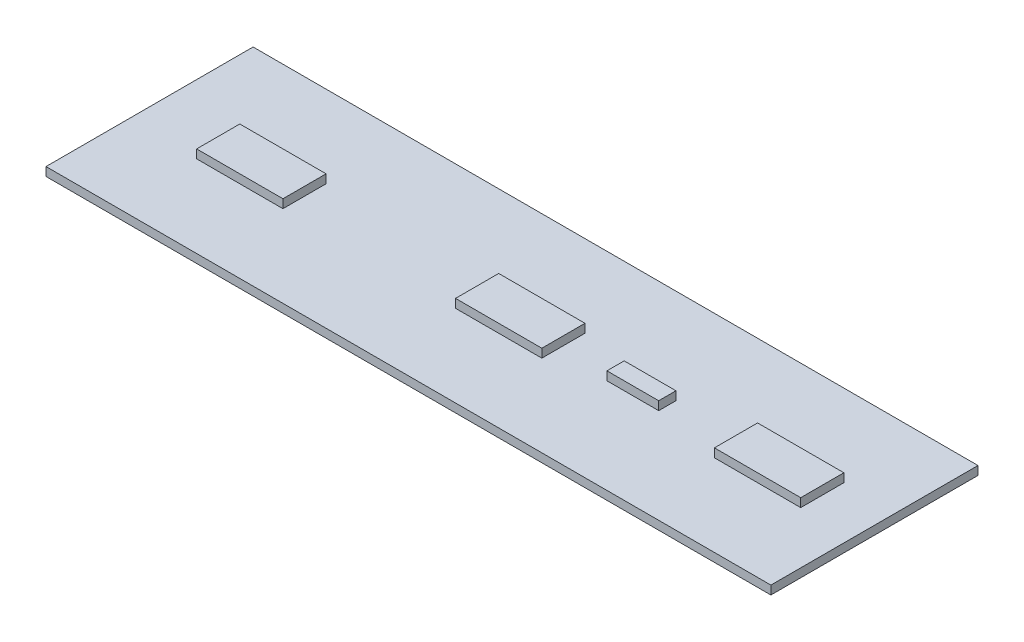
ISO-10303-21;
HEADER;
FILE_DESCRIPTION(('STEP AP214'),'2;1');
FILE_NAME('part.step','',(''),(''),'','','');
FILE_SCHEMA(('AUTOMOTIVE_DESIGN { 1 0 10303 214 1 1 1 1 }'));
ENDSEC;
DATA;
#1=APPLICATION_CONTEXT('core data for automotive mechanical design processes');
#2=APPLICATION_PROTOCOL_DEFINITION('international standard','automotive_design',2000,#1);
#3=PRODUCT_CONTEXT('',#1,'mechanical');
#4=PRODUCT('Part','Part','',(#3));
#5=PRODUCT_RELATED_PRODUCT_CATEGORY('part','',(#4));
#6=PRODUCT_DEFINITION_FORMATION('','',#4);
#7=PRODUCT_DEFINITION_CONTEXT('part definition',#1,'design');
#8=PRODUCT_DEFINITION('design','',#6,#7);
#9=PRODUCT_DEFINITION_SHAPE('','',#8);
#10=(LENGTH_UNIT() NAMED_UNIT(*) SI_UNIT(.MILLI.,.METRE.));
#11=(NAMED_UNIT(*) PLANE_ANGLE_UNIT() SI_UNIT($,.RADIAN.));
#12=(NAMED_UNIT(*) SI_UNIT($,.STERADIAN.) SOLID_ANGLE_UNIT());
#13=UNCERTAINTY_MEASURE_WITH_UNIT(LENGTH_MEASURE(1.E-05),#10,'distance_accuracy_value','');
#14=(GEOMETRIC_REPRESENTATION_CONTEXT(3) GLOBAL_UNCERTAINTY_ASSIGNED_CONTEXT((#13)) GLOBAL_UNIT_ASSIGNED_CONTEXT((#10,
#11,#12)) REPRESENTATION_CONTEXT('',''));
#15=CARTESIAN_POINT('',(0.,0.,0.));
#16=DIRECTION('',(0.,0.,1.));
#17=DIRECTION('',(1.,0.,0.));
#18=AXIS2_PLACEMENT_3D('',#15,#16,#17);
#19=CARTESIAN_POINT('',(0.,0.5,0.));
#20=DIRECTION('',(0.,1.,0.));
#21=DIRECTION('',(0.,0.,1.));
#22=AXIS2_PLACEMENT_3D('',#19,#20,#21);
#23=PLANE('',#22);
#24=DIRECTION('',(0.,0.,1.));
#25=VECTOR('',#24,1.);
#26=CARTESIAN_POINT('',(-24.7816091954023,0.5,-4.90804597701149));
#27=LINE('',#26,#25);
#28=CARTESIAN_POINT('',(-24.7816091954023,0.5,-4.90804597701149));
#29=VERTEX_POINT('',#28);
#30=CARTESIAN_POINT('',(-24.7816091954023,0.5,7.09195402298851));
#31=VERTEX_POINT('',#30);
#32=EDGE_CURVE('E288',#29,#31,#27,.T.);
#33=ORIENTED_EDGE('',*,*,#32,.T.);
#34=DIRECTION('',(1.,0.,0.));
#35=VECTOR('',#34,1.);
#36=CARTESIAN_POINT('',(-24.7816091954023,0.5,7.09195402298851));
#37=LINE('',#36,#35);
#38=CARTESIAN_POINT('',(17.2183908045977,0.5,7.09195402298851));
#39=VERTEX_POINT('',#38);
#40=EDGE_CURVE('E291',#31,#39,#37,.T.);
#41=ORIENTED_EDGE('',*,*,#40,.T.);
#42=DIRECTION('',(0.,0.,-1.));
#43=VECTOR('',#42,1.);
#44=CARTESIAN_POINT('',(17.2183908045977,0.5,-4.90804597701149));
#45=LINE('',#44,#43);
#46=CARTESIAN_POINT('',(17.2183908045977,0.5,-4.90804597701149));
#47=VERTEX_POINT('',#46);
#48=EDGE_CURVE('E294',#39,#47,#45,.T.);
#49=ORIENTED_EDGE('',*,*,#48,.T.);
#50=DIRECTION('',(-1.,0.,0.));
#51=VECTOR('',#50,1.);
#52=CARTESIAN_POINT('',(-24.7816091954023,0.5,-4.90804597701149));
#53=LINE('',#52,#51);
#54=EDGE_CURVE('E296',#47,#29,#53,.T.);
#55=ORIENTED_EDGE('',*,*,#54,.T.);
#56=EDGE_LOOP('',(#33,#41,#49,#55));
#57=FACE_BOUND('',#56,.T.);
#58=DIRECTION('',(-1.,0.,0.));
#59=VECTOR('',#58,1.);
#60=CARTESIAN_POINT('',(9.19700614513017,0.5,-0.158045977011493));
#61=LINE('',#60,#59);
#62=CARTESIAN_POINT('',(14.1970061451302,0.5,-0.158045977011493));
#63=VERTEX_POINT('',#62);
#64=CARTESIAN_POINT('',(9.19700614513017,0.5,-0.158045977011493));
#65=VERTEX_POINT('',#64);
#66=EDGE_CURVE('E272',#63,#65,#61,.T.);
#67=ORIENTED_EDGE('',*,*,#66,.F.);
#68=DIRECTION('',(0.,0.,-1.));
#69=VECTOR('',#68,1.);
#70=CARTESIAN_POINT('',(14.1970061451302,0.5,-0.158045977011493));
#71=LINE('',#70,#69);
#72=CARTESIAN_POINT('',(14.1970061451302,0.5,2.34195402298851));
#73=VERTEX_POINT('',#72);
#74=EDGE_CURVE('E258',#73,#63,#71,.T.);
#75=ORIENTED_EDGE('',*,*,#74,.F.);
#76=DIRECTION('',(1.,0.,0.));
#77=VECTOR('',#76,1.);
#78=CARTESIAN_POINT('',(9.19700614513017,0.5,2.34195402298851));
#79=LINE('',#78,#77);
#80=CARTESIAN_POINT('',(9.19700614513017,0.5,2.34195402298851));
#81=VERTEX_POINT('',#80);
#82=EDGE_CURVE('E263',#81,#73,#79,.T.);
#83=ORIENTED_EDGE('',*,*,#82,.F.);
#84=DIRECTION('',(0.,0.,1.));
#85=VECTOR('',#84,1.);
#86=CARTESIAN_POINT('',(9.19700614513017,0.5,-0.158045977011493));
#87=LINE('',#86,#85);
#88=EDGE_CURVE('E274',#65,#81,#87,.T.);
#89=ORIENTED_EDGE('',*,*,#88,.F.);
#90=EDGE_LOOP('',(#67,#75,#83,#89));
#91=FACE_BOUND('',#90,.T.);
#92=DIRECTION('',(0.,0.,-1.));
#93=VECTOR('',#92,1.);
#94=CARTESIAN_POINT('',(-0.802993854869824,0.5,-0.158045977011389));
#95=LINE('',#94,#93);
#96=CARTESIAN_POINT('',(-0.802993854869824,0.5,2.34195402298861));
#97=VERTEX_POINT('',#96);
#98=CARTESIAN_POINT('',(-0.802993854869824,0.5,-0.158045977011389));
#99=VERTEX_POINT('',#98);
#100=EDGE_CURVE('E243',#97,#99,#95,.T.);
#101=ORIENTED_EDGE('',*,*,#100,.F.);
#102=DIRECTION('',(1.,0.,0.));
#103=VECTOR('',#102,1.);
#104=CARTESIAN_POINT('',(-5.80299385486983,0.5,2.34195402298861));
#105=LINE('',#104,#103);
#106=CARTESIAN_POINT('',(-5.80299385486983,0.5,2.34195402298861));
#107=VERTEX_POINT('',#106);
#108=EDGE_CURVE('E229',#107,#97,#105,.T.);
#109=ORIENTED_EDGE('',*,*,#108,.F.);
#110=DIRECTION('',(0.,0.,1.));
#111=VECTOR('',#110,1.);
#112=CARTESIAN_POINT('',(-5.80299385486983,0.5,-0.158045977011389));
#113=LINE('',#112,#111);
#114=CARTESIAN_POINT('',(-5.80299385486983,0.5,-0.158045977011389));
#115=VERTEX_POINT('',#114);
#116=EDGE_CURVE('E234',#115,#107,#113,.T.);
#117=ORIENTED_EDGE('',*,*,#116,.F.);
#118=DIRECTION('',(-1.,0.,0.));
#119=VECTOR('',#118,1.);
#120=CARTESIAN_POINT('',(-5.80299385486983,0.5,-0.158045977011389));
#121=LINE('',#120,#119);
#122=EDGE_CURVE('E245',#99,#115,#121,.T.);
#123=ORIENTED_EDGE('',*,*,#122,.F.);
#124=EDGE_LOOP('',(#101,#109,#117,#123));
#125=FACE_BOUND('',#124,.T.);
#126=DIRECTION('',(0.,0.,-1.));
#127=VECTOR('',#126,1.);
#128=CARTESIAN_POINT('',(-15.8029938548698,0.5,-0.158045977011284));
#129=LINE('',#128,#127);
#130=CARTESIAN_POINT('',(-15.8029938548698,0.5,2.34195402298872));
#131=VERTEX_POINT('',#130);
#132=CARTESIAN_POINT('',(-15.8029938548698,0.5,-0.158045977011284));
#133=VERTEX_POINT('',#132);
#134=EDGE_CURVE('E201',#131,#133,#129,.T.);
#135=ORIENTED_EDGE('',*,*,#134,.F.);
#136=DIRECTION('',(1.,0.,0.));
#137=VECTOR('',#136,1.);
#138=CARTESIAN_POINT('',(-20.8029938548698,0.5,2.34195402298872));
#139=LINE('',#138,#137);
#140=CARTESIAN_POINT('',(-20.8029938548698,0.5,2.34195402298872));
#141=VERTEX_POINT('',#140);
#142=EDGE_CURVE('E198',#141,#131,#139,.T.);
#143=ORIENTED_EDGE('',*,*,#142,.F.);
#144=DIRECTION('',(0.,0.,1.));
#145=VECTOR('',#144,1.);
#146=CARTESIAN_POINT('',(-20.8029938548698,0.5,-0.158045977011284));
#147=LINE('',#146,#145);
#148=CARTESIAN_POINT('',(-20.8029938548698,0.5,-0.158045977011284));
#149=VERTEX_POINT('',#148);
#150=EDGE_CURVE('E210',#149,#141,#147,.T.);
#151=ORIENTED_EDGE('',*,*,#150,.F.);
#152=DIRECTION('',(-1.,0.,0.));
#153=VECTOR('',#152,1.);
#154=CARTESIAN_POINT('',(-20.8029938548698,0.5,-0.158045977011284));
#155=LINE('',#154,#153);
#156=EDGE_CURVE('E218',#133,#149,#155,.T.);
#157=ORIENTED_EDGE('',*,*,#156,.F.);
#158=EDGE_LOOP('',(#135,#143,#151,#157));
#159=FACE_BOUND('',#158,.T.);
#160=DIRECTION('',(-1.,0.,0.));
#161=VECTOR('',#160,1.);
#162=CARTESIAN_POINT('',(2.21839080459771,0.5,0.591954022988515));
#163=LINE('',#162,#161);
#164=CARTESIAN_POINT('',(5.21839080459771,0.5,0.591954022988515));
#165=VERTEX_POINT('',#164);
#166=CARTESIAN_POINT('',(2.21839080459771,0.5,0.591954022988515));
#167=VERTEX_POINT('',#166);
#168=EDGE_CURVE('E585',#165,#167,#163,.T.);
#169=ORIENTED_EDGE('',*,*,#168,.F.);
#170=DIRECTION('',(0.,0.,-1.));
#171=VECTOR('',#170,1.);
#172=CARTESIAN_POINT('',(5.21839080459771,0.5,0.591954022988515));
#173=LINE('',#172,#171);
#174=CARTESIAN_POINT('',(5.21839080459771,0.5,1.59195402298851));
#175=VERTEX_POINT('',#174);
#176=EDGE_CURVE('E196',#175,#165,#173,.T.);
#177=ORIENTED_EDGE('',*,*,#176,.F.);
#178=DIRECTION('',(1.,0.,0.));
#179=VECTOR('',#178,1.);
#180=CARTESIAN_POINT('',(2.21839080459771,0.5,1.59195402298851));
#181=LINE('',#180,#179);
#182=CARTESIAN_POINT('',(2.21839080459771,0.5,1.59195402298851));
#183=VERTEX_POINT('',#182);
#184=EDGE_CURVE('E192',#183,#175,#181,.T.);
#185=ORIENTED_EDGE('',*,*,#184,.F.);
#186=DIRECTION('',(0.,0.,1.));
#187=VECTOR('',#186,1.);
#188=CARTESIAN_POINT('',(2.21839080459771,0.5,0.591954022988515));
#189=LINE('',#188,#187);
#190=EDGE_CURVE('E582',#167,#183,#189,.T.);
#191=ORIENTED_EDGE('',*,*,#190,.F.);
#192=EDGE_LOOP('',(#169,#177,#185,#191));
#193=FACE_BOUND('',#192,.T.);
#194=ADVANCED_FACE('F35',(#57,#91,#125,#159,#193),#23,.T.);
#195=CARTESIAN_POINT('',(-24.7816091954023,0.5,-4.90804597701149));
#196=DIRECTION('',(1.,0.,0.));
#197=DIRECTION('',(0.,0.,-1.));
#198=AXIS2_PLACEMENT_3D('',#195,#196,#197);
#199=PLANE('',#198);
#200=DIRECTION('',(0.,0.,1.));
#201=VECTOR('',#200,1.);
#202=CARTESIAN_POINT('',(-24.7816091954023,0.,-4.90804597701149));
#203=LINE('',#202,#201);
#204=CARTESIAN_POINT('',(-24.7816091954023,0.,-4.90804597701149));
#205=VERTEX_POINT('',#204);
#206=CARTESIAN_POINT('',(-24.7816091954023,0.,7.09195402298851));
#207=VERTEX_POINT('',#206);
#208=EDGE_CURVE('E287',#205,#207,#203,.T.);
#209=ORIENTED_EDGE('',*,*,#208,.T.);
#210=DIRECTION('',(0.,-1.,0.));
#211=VECTOR('',#210,1.);
#212=CARTESIAN_POINT('',(-24.7816091954023,0.5,7.09195402298851));
#213=LINE('',#212,#211);
#214=EDGE_CURVE('E11',#31,#207,#213,.T.);
#215=ORIENTED_EDGE('',*,*,#214,.F.);
#216=ORIENTED_EDGE('',*,*,#32,.F.);
#217=DIRECTION('',(0.,-1.,0.));
#218=VECTOR('',#217,1.);
#219=CARTESIAN_POINT('',(-24.7816091954023,0.5,-4.90804597701149));
#220=LINE('',#219,#218);
#221=EDGE_CURVE('E298',#29,#205,#220,.T.);
#222=ORIENTED_EDGE('',*,*,#221,.T.);
#223=EDGE_LOOP('',(#209,#215,#216,#222));
#224=FACE_BOUND('',#223,.T.);
#225=ADVANCED_FACE('F37',(#224),#199,.F.);
#226=CARTESIAN_POINT('',(-24.7816091954023,0.5,7.09195402298851));
#227=DIRECTION('',(0.,0.,-1.));
#228=DIRECTION('',(-1.,0.,0.));
#229=AXIS2_PLACEMENT_3D('',#226,#227,#228);
#230=PLANE('',#229);
#231=DIRECTION('',(1.,0.,0.));
#232=VECTOR('',#231,1.);
#233=CARTESIAN_POINT('',(-24.7816091954023,0.,7.09195402298851));
#234=LINE('',#233,#232);
#235=CARTESIAN_POINT('',(17.2183908045977,0.,7.09195402298851));
#236=VERTEX_POINT('',#235);
#237=EDGE_CURVE('E301',#207,#236,#234,.T.);
#238=ORIENTED_EDGE('',*,*,#237,.T.);
#239=DIRECTION('',(0.,-1.,0.));
#240=VECTOR('',#239,1.);
#241=CARTESIAN_POINT('',(17.2183908045977,0.5,7.09195402298851));
#242=LINE('',#241,#240);
#243=EDGE_CURVE('E43',#39,#236,#242,.T.);
#244=ORIENTED_EDGE('',*,*,#243,.F.);
#245=ORIENTED_EDGE('',*,*,#40,.F.);
#246=ORIENTED_EDGE('',*,*,#214,.T.);
#247=EDGE_LOOP('',(#238,#244,#245,#246));
#248=FACE_BOUND('',#247,.T.);
#249=ADVANCED_FACE('F331',(#248),#230,.F.);
#250=CARTESIAN_POINT('',(17.2183908045977,0.5,-4.90804597701149));
#251=DIRECTION('',(-1.,0.,0.));
#252=DIRECTION('',(0.,0.,1.));
#253=AXIS2_PLACEMENT_3D('',#250,#251,#252);
#254=PLANE('',#253);
#255=DIRECTION('',(0.,0.,-1.));
#256=VECTOR('',#255,1.);
#257=CARTESIAN_POINT('',(17.2183908045977,0.,-4.90804597701149));
#258=LINE('',#257,#256);
#259=CARTESIAN_POINT('',(17.2183908045977,0.,-4.90804597701149));
#260=VERTEX_POINT('',#259);
#261=EDGE_CURVE('E303',#236,#260,#258,.T.);
#262=ORIENTED_EDGE('',*,*,#261,.T.);
#263=DIRECTION('',(0.,-1.,0.));
#264=VECTOR('',#263,1.);
#265=CARTESIAN_POINT('',(17.2183908045977,0.5,-4.90804597701149));
#266=LINE('',#265,#264);
#267=EDGE_CURVE('E308',#47,#260,#266,.T.);
#268=ORIENTED_EDGE('',*,*,#267,.F.);
#269=ORIENTED_EDGE('',*,*,#48,.F.);
#270=ORIENTED_EDGE('',*,*,#243,.T.);
#271=EDGE_LOOP('',(#262,#268,#269,#270));
#272=FACE_BOUND('',#271,.T.);
#273=ADVANCED_FACE('F315',(#272),#254,.F.);
#274=CARTESIAN_POINT('',(-24.7816091954023,0.5,-4.90804597701149));
#275=DIRECTION('',(0.,0.,1.));
#276=DIRECTION('',(1.,0.,0.));
#277=AXIS2_PLACEMENT_3D('',#274,#275,#276);
#278=PLANE('',#277);
#279=DIRECTION('',(-1.,0.,0.));
#280=VECTOR('',#279,1.);
#281=CARTESIAN_POINT('',(-24.7816091954023,0.,-4.90804597701149));
#282=LINE('',#281,#280);
#283=EDGE_CURVE('E292',#260,#205,#282,.T.);
#284=ORIENTED_EDGE('',*,*,#283,.T.);
#285=ORIENTED_EDGE('',*,*,#221,.F.);
#286=ORIENTED_EDGE('',*,*,#54,.F.);
#287=ORIENTED_EDGE('',*,*,#267,.T.);
#288=EDGE_LOOP('',(#284,#285,#286,#287));
#289=FACE_BOUND('',#288,.T.);
#290=ADVANCED_FACE('F324',(#289),#278,.F.);
#291=CARTESIAN_POINT('',(0.,0.,0.));
#292=DIRECTION('',(0.,1.,0.));
#293=DIRECTION('',(0.,0.,1.));
#294=AXIS2_PLACEMENT_3D('',#291,#292,#293);
#295=PLANE('',#294);
#296=ORIENTED_EDGE('',*,*,#208,.F.);
#297=ORIENTED_EDGE('',*,*,#283,.F.);
#298=ORIENTED_EDGE('',*,*,#261,.F.);
#299=ORIENTED_EDGE('',*,*,#237,.F.);
#300=EDGE_LOOP('',(#296,#297,#298,#299));
#301=FACE_BOUND('',#300,.T.);
#302=ADVANCED_FACE('F321',(#301),#295,.F.);
#303=CARTESIAN_POINT('',(14.1970061451302,1.,-0.158045977011493));
#304=DIRECTION('',(-1.,0.,0.));
#305=DIRECTION('',(0.,0.,1.));
#306=AXIS2_PLACEMENT_3D('',#303,#304,#305);
#307=PLANE('',#306);
#308=ORIENTED_EDGE('',*,*,#74,.T.);
#309=DIRECTION('',(0.,-1.,0.));
#310=VECTOR('',#309,1.);
#311=CARTESIAN_POINT('',(14.1970061451302,1.,-0.158045977011493));
#312=LINE('',#311,#310);
#313=CARTESIAN_POINT('',(14.1970061451302,1.,-0.158045977011493));
#314=VERTEX_POINT('',#313);
#315=EDGE_CURVE('E285',#314,#63,#312,.T.);
#316=ORIENTED_EDGE('',*,*,#315,.F.);
#317=DIRECTION('',(0.,0.,-1.));
#318=VECTOR('',#317,1.);
#319=CARTESIAN_POINT('',(14.1970061451302,1.,-0.158045977011493));
#320=LINE('',#319,#318);
#321=CARTESIAN_POINT('',(14.1970061451302,1.,2.34195402298851));
#322=VERTEX_POINT('',#321);
#323=EDGE_CURVE('E259',#322,#314,#320,.T.);
#324=ORIENTED_EDGE('',*,*,#323,.F.);
#325=DIRECTION('',(0.,-1.,0.));
#326=VECTOR('',#325,1.);
#327=CARTESIAN_POINT('',(14.1970061451302,1.,2.34195402298851));
#328=LINE('',#327,#326);
#329=EDGE_CURVE('E269',#322,#73,#328,.T.);
#330=ORIENTED_EDGE('',*,*,#329,.T.);
#331=EDGE_LOOP('',(#308,#316,#324,#330));
#332=FACE_BOUND('',#331,.T.);
#333=ADVANCED_FACE('F344',(#332),#307,.F.);
#334=CARTESIAN_POINT('',(9.19700614513017,1.,-0.158045977011493));
#335=DIRECTION('',(0.,0.,1.));
#336=DIRECTION('',(1.,0.,0.));
#337=AXIS2_PLACEMENT_3D('',#334,#335,#336);
#338=PLANE('',#337);
#339=ORIENTED_EDGE('',*,*,#66,.T.);
#340=DIRECTION('',(0.,-1.,0.));
#341=VECTOR('',#340,1.);
#342=CARTESIAN_POINT('',(9.19700614513017,1.,-0.158045977011493));
#343=LINE('',#342,#341);
#344=CARTESIAN_POINT('',(9.19700614513017,1.,-0.158045977011493));
#345=VERTEX_POINT('',#344);
#346=EDGE_CURVE('E282',#345,#65,#343,.T.);
#347=ORIENTED_EDGE('',*,*,#346,.F.);
#348=DIRECTION('',(-1.,0.,0.));
#349=VECTOR('',#348,1.);
#350=CARTESIAN_POINT('',(9.19700614513017,1.,-0.158045977011493));
#351=LINE('',#350,#349);
#352=EDGE_CURVE('E262',#314,#345,#351,.T.);
#353=ORIENTED_EDGE('',*,*,#352,.F.);
#354=ORIENTED_EDGE('',*,*,#315,.T.);
#355=EDGE_LOOP('',(#339,#347,#353,#354));
#356=FACE_BOUND('',#355,.T.);
#357=ADVANCED_FACE('F363',(#356),#338,.F.);
#358=CARTESIAN_POINT('',(9.19700614513017,1.,-0.158045977011493));
#359=DIRECTION('',(1.,0.,0.));
#360=DIRECTION('',(0.,0.,-1.));
#361=AXIS2_PLACEMENT_3D('',#358,#359,#360);
#362=PLANE('',#361);
#363=ORIENTED_EDGE('',*,*,#88,.T.);
#364=DIRECTION('',(0.,-1.,0.));
#365=VECTOR('',#364,1.);
#366=CARTESIAN_POINT('',(9.19700614513017,1.,2.34195402298851));
#367=LINE('',#366,#365);
#368=CARTESIAN_POINT('',(9.19700614513017,1.,2.34195402298851));
#369=VERTEX_POINT('',#368);
#370=EDGE_CURVE('E280',#369,#81,#367,.T.);
#371=ORIENTED_EDGE('',*,*,#370,.F.);
#372=DIRECTION('',(0.,0.,1.));
#373=VECTOR('',#372,1.);
#374=CARTESIAN_POINT('',(9.19700614513017,1.,-0.158045977011493));
#375=LINE('',#374,#373);
#376=EDGE_CURVE('E265',#345,#369,#375,.T.);
#377=ORIENTED_EDGE('',*,*,#376,.F.);
#378=ORIENTED_EDGE('',*,*,#346,.T.);
#379=EDGE_LOOP('',(#363,#371,#377,#378));
#380=FACE_BOUND('',#379,.T.);
#381=ADVANCED_FACE('F370',(#380),#362,.F.);
#382=CARTESIAN_POINT('',(9.19700614513017,1.,2.34195402298851));
#383=DIRECTION('',(0.,0.,-1.));
#384=DIRECTION('',(-1.,0.,0.));
#385=AXIS2_PLACEMENT_3D('',#382,#383,#384);
#386=PLANE('',#385);
#387=ORIENTED_EDGE('',*,*,#82,.T.);
#388=ORIENTED_EDGE('',*,*,#329,.F.);
#389=DIRECTION('',(1.,0.,0.));
#390=VECTOR('',#389,1.);
#391=CARTESIAN_POINT('',(9.19700614513017,1.,2.34195402298851));
#392=LINE('',#391,#390);
#393=EDGE_CURVE('E267',#369,#322,#392,.T.);
#394=ORIENTED_EDGE('',*,*,#393,.F.);
#395=ORIENTED_EDGE('',*,*,#370,.T.);
#396=EDGE_LOOP('',(#387,#388,#394,#395));
#397=FACE_BOUND('',#396,.T.);
#398=ADVANCED_FACE('F377',(#397),#386,.F.);
#399=CARTESIAN_POINT('',(0.,1.,0.));
#400=DIRECTION('',(0.,1.,0.));
#401=DIRECTION('',(0.,0.,1.));
#402=AXIS2_PLACEMENT_3D('',#399,#400,#401);
#403=PLANE('',#402);
#404=ORIENTED_EDGE('',*,*,#323,.T.);
#405=ORIENTED_EDGE('',*,*,#352,.T.);
#406=ORIENTED_EDGE('',*,*,#376,.T.);
#407=ORIENTED_EDGE('',*,*,#393,.T.);
#408=EDGE_LOOP('',(#404,#405,#406,#407));
#409=FACE_BOUND('',#408,.T.);
#410=ADVANCED_FACE('F385',(#409),#403,.T.);
#411=CARTESIAN_POINT('',(-5.80299385486983,1.,2.34195402298861));
#412=DIRECTION('',(0.,0.,-1.));
#413=DIRECTION('',(-1.,0.,0.));
#414=AXIS2_PLACEMENT_3D('',#411,#412,#413);
#415=PLANE('',#414);
#416=ORIENTED_EDGE('',*,*,#108,.T.);
#417=DIRECTION('',(0.,-1.,0.));
#418=VECTOR('',#417,1.);
#419=CARTESIAN_POINT('',(-0.802993854869824,1.,2.34195402298861));
#420=LINE('',#419,#418);
#421=CARTESIAN_POINT('',(-0.802993854869824,1.,2.34195402298861));
#422=VERTEX_POINT('',#421);
#423=EDGE_CURVE('E256',#422,#97,#420,.T.);
#424=ORIENTED_EDGE('',*,*,#423,.F.);
#425=DIRECTION('',(1.,0.,0.));
#426=VECTOR('',#425,1.);
#427=CARTESIAN_POINT('',(-5.80299385486983,1.,2.34195402298861));
#428=LINE('',#427,#426);
#429=CARTESIAN_POINT('',(-5.80299385486983,1.,2.34195402298861));
#430=VERTEX_POINT('',#429);
#431=EDGE_CURVE('E230',#430,#422,#428,.T.);
#432=ORIENTED_EDGE('',*,*,#431,.F.);
#433=DIRECTION('',(0.,-1.,0.));
#434=VECTOR('',#433,1.);
#435=CARTESIAN_POINT('',(-5.80299385486983,1.,2.34195402298861));
#436=LINE('',#435,#434);
#437=EDGE_CURVE('E240',#430,#107,#436,.T.);
#438=ORIENTED_EDGE('',*,*,#437,.T.);
#439=EDGE_LOOP('',(#416,#424,#432,#438));
#440=FACE_BOUND('',#439,.T.);
#441=ADVANCED_FACE('F394',(#440),#415,.F.);
#442=CARTESIAN_POINT('',(-0.802993854869824,1.,-0.158045977011389));
#443=DIRECTION('',(-1.,0.,0.));
#444=DIRECTION('',(0.,0.,1.));
#445=AXIS2_PLACEMENT_3D('',#442,#443,#444);
#446=PLANE('',#445);
#447=ORIENTED_EDGE('',*,*,#100,.T.);
#448=DIRECTION('',(0.,-1.,0.));
#449=VECTOR('',#448,1.);
#450=CARTESIAN_POINT('',(-0.802993854869824,1.,-0.158045977011389));
#451=LINE('',#450,#449);
#452=CARTESIAN_POINT('',(-0.802993854869824,1.,-0.158045977011389));
#453=VERTEX_POINT('',#452);
#454=EDGE_CURVE('E253',#453,#99,#451,.T.);
#455=ORIENTED_EDGE('',*,*,#454,.F.);
#456=DIRECTION('',(0.,0.,-1.));
#457=VECTOR('',#456,1.);
#458=CARTESIAN_POINT('',(-0.802993854869824,1.,-0.158045977011389));
#459=LINE('',#458,#457);
#460=EDGE_CURVE('E233',#422,#453,#459,.T.);
#461=ORIENTED_EDGE('',*,*,#460,.F.);
#462=ORIENTED_EDGE('',*,*,#423,.T.);
#463=EDGE_LOOP('',(#447,#455,#461,#462));
#464=FACE_BOUND('',#463,.T.);
#465=ADVANCED_FACE('F402',(#464),#446,.F.);
#466=CARTESIAN_POINT('',(-5.80299385486983,1.,-0.158045977011389));
#467=DIRECTION('',(0.,0.,1.));
#468=DIRECTION('',(1.,0.,0.));
#469=AXIS2_PLACEMENT_3D('',#466,#467,#468);
#470=PLANE('',#469);
#471=ORIENTED_EDGE('',*,*,#122,.T.);
#472=DIRECTION('',(0.,-1.,0.));
#473=VECTOR('',#472,1.);
#474=CARTESIAN_POINT('',(-5.80299385486983,1.,-0.158045977011389));
#475=LINE('',#474,#473);
#476=CARTESIAN_POINT('',(-5.80299385486983,1.,-0.158045977011389));
#477=VERTEX_POINT('',#476);
#478=EDGE_CURVE('E251',#477,#115,#475,.T.);
#479=ORIENTED_EDGE('',*,*,#478,.F.);
#480=DIRECTION('',(-1.,0.,0.));
#481=VECTOR('',#480,1.);
#482=CARTESIAN_POINT('',(-5.80299385486983,1.,-0.158045977011389));
#483=LINE('',#482,#481);
#484=EDGE_CURVE('E236',#453,#477,#483,.T.);
#485=ORIENTED_EDGE('',*,*,#484,.F.);
#486=ORIENTED_EDGE('',*,*,#454,.T.);
#487=EDGE_LOOP('',(#471,#479,#485,#486));
#488=FACE_BOUND('',#487,.T.);
#489=ADVANCED_FACE('F410',(#488),#470,.F.);
#490=CARTESIAN_POINT('',(-5.80299385486983,1.,-0.158045977011389));
#491=DIRECTION('',(1.,0.,0.));
#492=DIRECTION('',(0.,0.,-1.));
#493=AXIS2_PLACEMENT_3D('',#490,#491,#492);
#494=PLANE('',#493);
#495=ORIENTED_EDGE('',*,*,#116,.T.);
#496=ORIENTED_EDGE('',*,*,#437,.F.);
#497=DIRECTION('',(0.,0.,1.));
#498=VECTOR('',#497,1.);
#499=CARTESIAN_POINT('',(-5.80299385486983,1.,-0.158045977011389));
#500=LINE('',#499,#498);
#501=EDGE_CURVE('E238',#477,#430,#500,.T.);
#502=ORIENTED_EDGE('',*,*,#501,.F.);
#503=ORIENTED_EDGE('',*,*,#478,.T.);
#504=EDGE_LOOP('',(#495,#496,#502,#503));
#505=FACE_BOUND('',#504,.T.);
#506=ADVANCED_FACE('F418',(#505),#494,.F.);
#507=CARTESIAN_POINT('',(0.,1.,0.));
#508=DIRECTION('',(0.,-1.,0.));
#509=DIRECTION('',(0.,0.,-1.));
#510=AXIS2_PLACEMENT_3D('',#507,#508,#509);
#511=PLANE('',#510);
#512=ORIENTED_EDGE('',*,*,#431,.T.);
#513=ORIENTED_EDGE('',*,*,#460,.T.);
#514=ORIENTED_EDGE('',*,*,#484,.T.);
#515=ORIENTED_EDGE('',*,*,#501,.T.);
#516=EDGE_LOOP('',(#512,#513,#514,#515));
#517=FACE_BOUND('',#516,.T.);
#518=ADVANCED_FACE('F426',(#517),#511,.F.);
#519=CARTESIAN_POINT('',(-20.8029938548698,1.,2.34195402298872));
#520=DIRECTION('',(0.,0.,-1.));
#521=DIRECTION('',(-1.,0.,0.));
#522=AXIS2_PLACEMENT_3D('',#519,#520,#521);
#523=PLANE('',#522);
#524=ORIENTED_EDGE('',*,*,#142,.T.);
#525=DIRECTION('',(0.,-1.,0.));
#526=VECTOR('',#525,1.);
#527=CARTESIAN_POINT('',(-15.8029938548698,1.,2.34195402298872));
#528=LINE('',#527,#526);
#529=CARTESIAN_POINT('',(-15.8029938548698,1.,2.34195402298872));
#530=VERTEX_POINT('',#529);
#531=EDGE_CURVE('E227',#530,#131,#528,.T.);
#532=ORIENTED_EDGE('',*,*,#531,.F.);
#533=DIRECTION('',(1.,0.,0.));
#534=VECTOR('',#533,1.);
#535=CARTESIAN_POINT('',(-20.8029938548698,1.,2.34195402298872));
#536=LINE('',#535,#534);
#537=CARTESIAN_POINT('',(-20.8029938548698,1.,2.34195402298872));
#538=VERTEX_POINT('',#537);
#539=EDGE_CURVE('E206',#538,#530,#536,.T.);
#540=ORIENTED_EDGE('',*,*,#539,.F.);
#541=DIRECTION('',(0.,-1.,0.));
#542=VECTOR('',#541,1.);
#543=CARTESIAN_POINT('',(-20.8029938548698,1.,2.34195402298872));
#544=LINE('',#543,#542);
#545=EDGE_CURVE('E215',#538,#141,#544,.T.);
#546=ORIENTED_EDGE('',*,*,#545,.T.);
#547=EDGE_LOOP('',(#524,#532,#540,#546));
#548=FACE_BOUND('',#547,.T.);
#549=ADVANCED_FACE('F434',(#548),#523,.F.);
#550=CARTESIAN_POINT('',(-15.8029938548698,1.,-0.158045977011284));
#551=DIRECTION('',(-1.,0.,0.));
#552=DIRECTION('',(0.,0.,1.));
#553=AXIS2_PLACEMENT_3D('',#550,#551,#552);
#554=PLANE('',#553);
#555=ORIENTED_EDGE('',*,*,#134,.T.);
#556=DIRECTION('',(0.,-1.,0.));
#557=VECTOR('',#556,1.);
#558=CARTESIAN_POINT('',(-15.8029938548698,1.,-0.158045977011284));
#559=LINE('',#558,#557);
#560=CARTESIAN_POINT('',(-15.8029938548698,1.,-0.158045977011284));
#561=VERTEX_POINT('',#560);
#562=EDGE_CURVE('E224',#561,#133,#559,.T.);
#563=ORIENTED_EDGE('',*,*,#562,.F.);
#564=DIRECTION('',(0.,0.,-1.));
#565=VECTOR('',#564,1.);
#566=CARTESIAN_POINT('',(-15.8029938548698,1.,-0.158045977011284));
#567=LINE('',#566,#565);
#568=EDGE_CURVE('E209',#530,#561,#567,.T.);
#569=ORIENTED_EDGE('',*,*,#568,.F.);
#570=ORIENTED_EDGE('',*,*,#531,.T.);
#571=EDGE_LOOP('',(#555,#563,#569,#570));
#572=FACE_BOUND('',#571,.T.);
#573=ADVANCED_FACE('F442',(#572),#554,.F.);
#574=CARTESIAN_POINT('',(-20.8029938548698,1.,-0.158045977011284));
#575=DIRECTION('',(0.,0.,1.));
#576=DIRECTION('',(1.,0.,0.));
#577=AXIS2_PLACEMENT_3D('',#574,#575,#576);
#578=PLANE('',#577);
#579=ORIENTED_EDGE('',*,*,#156,.T.);
#580=DIRECTION('',(0.,-1.,0.));
#581=VECTOR('',#580,1.);
#582=CARTESIAN_POINT('',(-20.8029938548698,1.,-0.158045977011284));
#583=LINE('',#582,#581);
#584=CARTESIAN_POINT('',(-20.8029938548698,1.,-0.158045977011284));
#585=VERTEX_POINT('',#584);
#586=EDGE_CURVE('E58',#585,#149,#583,.T.);
#587=ORIENTED_EDGE('',*,*,#586,.F.);
#588=DIRECTION('',(-1.,0.,0.));
#589=VECTOR('',#588,1.);
#590=CARTESIAN_POINT('',(-20.8029938548698,1.,-0.158045977011284));
#591=LINE('',#590,#589);
#592=EDGE_CURVE('E212',#561,#585,#591,.T.);
#593=ORIENTED_EDGE('',*,*,#592,.F.);
#594=ORIENTED_EDGE('',*,*,#562,.T.);
#595=EDGE_LOOP('',(#579,#587,#593,#594));
#596=FACE_BOUND('',#595,.T.);
#597=ADVANCED_FACE('F450',(#596),#578,.F.);
#598=CARTESIAN_POINT('',(-20.8029938548698,1.,-0.158045977011284));
#599=DIRECTION('',(1.,0.,0.));
#600=DIRECTION('',(0.,0.,-1.));
#601=AXIS2_PLACEMENT_3D('',#598,#599,#600);
#602=PLANE('',#601);
#603=ORIENTED_EDGE('',*,*,#150,.T.);
#604=ORIENTED_EDGE('',*,*,#545,.F.);
#605=DIRECTION('',(0.,0.,1.));
#606=VECTOR('',#605,1.);
#607=CARTESIAN_POINT('',(-20.8029938548698,1.,-0.158045977011284));
#608=LINE('',#607,#606);
#609=EDGE_CURVE('E214',#585,#538,#608,.T.);
#610=ORIENTED_EDGE('',*,*,#609,.F.);
#611=ORIENTED_EDGE('',*,*,#586,.T.);
#612=EDGE_LOOP('',(#603,#604,#610,#611));
#613=FACE_BOUND('',#612,.T.);
#614=ADVANCED_FACE('F458',(#613),#602,.F.);
#615=CARTESIAN_POINT('',(0.,1.,0.));
#616=DIRECTION('',(0.,-1.,0.));
#617=DIRECTION('',(0.,0.,-1.));
#618=AXIS2_PLACEMENT_3D('',#615,#616,#617);
#619=PLANE('',#618);
#620=ORIENTED_EDGE('',*,*,#539,.T.);
#621=ORIENTED_EDGE('',*,*,#568,.T.);
#622=ORIENTED_EDGE('',*,*,#592,.T.);
#623=ORIENTED_EDGE('',*,*,#609,.T.);
#624=EDGE_LOOP('',(#620,#621,#622,#623));
#625=FACE_BOUND('',#624,.T.);
#626=ADVANCED_FACE('F466',(#625),#619,.F.);
#627=CARTESIAN_POINT('',(5.21839080459771,1.,0.591954022988515));
#628=DIRECTION('',(-1.,0.,0.));
#629=DIRECTION('',(0.,0.,1.));
#630=AXIS2_PLACEMENT_3D('',#627,#628,#629);
#631=PLANE('',#630);
#632=ORIENTED_EDGE('',*,*,#176,.T.);
#633=DIRECTION('',(0.,-1.,0.));
#634=VECTOR('',#633,1.);
#635=CARTESIAN_POINT('',(5.21839080459771,1.,0.591954022988515));
#636=LINE('',#635,#634);
#637=CARTESIAN_POINT('',(5.21839080459771,1.,0.591954022988515));
#638=VERTEX_POINT('',#637);
#639=EDGE_CURVE('E177',#638,#165,#636,.T.);
#640=ORIENTED_EDGE('',*,*,#639,.F.);
#641=DIRECTION('',(0.,0.,-1.));
#642=VECTOR('',#641,1.);
#643=CARTESIAN_POINT('',(5.21839080459771,1.,0.591954022988515));
#644=LINE('',#643,#642);
#645=CARTESIAN_POINT('',(5.21839080459771,1.,1.59195402298851));
#646=VERTEX_POINT('',#645);
#647=EDGE_CURVE('E184',#646,#638,#644,.T.);
#648=ORIENTED_EDGE('',*,*,#647,.F.);
#649=DIRECTION('',(0.,-1.,0.));
#650=VECTOR('',#649,1.);
#651=CARTESIAN_POINT('',(5.21839080459771,1.,1.59195402298851));
#652=LINE('',#651,#650);
#653=EDGE_CURVE('E579',#646,#175,#652,.T.);
#654=ORIENTED_EDGE('',*,*,#653,.T.);
#655=EDGE_LOOP('',(#632,#640,#648,#654));
#656=FACE_BOUND('',#655,.T.);
#657=ADVANCED_FACE('F194',(#656),#631,.F.);
#658=CARTESIAN_POINT('',(2.21839080459771,1.,0.591954022988515));
#659=DIRECTION('',(0.,0.,1.));
#660=DIRECTION('',(1.,0.,0.));
#661=AXIS2_PLACEMENT_3D('',#658,#659,#660);
#662=PLANE('',#661);
#663=ORIENTED_EDGE('',*,*,#168,.T.);
#664=DIRECTION('',(0.,-1.,0.));
#665=VECTOR('',#664,1.);
#666=CARTESIAN_POINT('',(2.21839080459771,1.,0.591954022988515));
#667=LINE('',#666,#665);
#668=CARTESIAN_POINT('',(2.21839080459771,1.,0.591954022988515));
#669=VERTEX_POINT('',#668);
#670=EDGE_CURVE('E180',#669,#167,#667,.T.);
#671=ORIENTED_EDGE('',*,*,#670,.F.);
#672=DIRECTION('',(-1.,0.,0.));
#673=VECTOR('',#672,1.);
#674=CARTESIAN_POINT('',(2.21839080459771,1.,0.591954022988515));
#675=LINE('',#674,#673);
#676=EDGE_CURVE('E173',#638,#669,#675,.T.);
#677=ORIENTED_EDGE('',*,*,#676,.F.);
#678=ORIENTED_EDGE('',*,*,#639,.T.);
#679=EDGE_LOOP('',(#663,#671,#677,#678));
#680=FACE_BOUND('',#679,.T.);
#681=ADVANCED_FACE('F175',(#680),#662,.F.);
#682=CARTESIAN_POINT('',(2.21839080459771,1.,0.591954022988515));
#683=DIRECTION('',(1.,0.,0.));
#684=DIRECTION('',(0.,0.,-1.));
#685=AXIS2_PLACEMENT_3D('',#682,#683,#684);
#686=PLANE('',#685);
#687=ORIENTED_EDGE('',*,*,#190,.T.);
#688=DIRECTION('',(0.,-1.,0.));
#689=VECTOR('',#688,1.);
#690=CARTESIAN_POINT('',(2.21839080459771,1.,1.59195402298851));
#691=LINE('',#690,#689);
#692=CARTESIAN_POINT('',(2.21839080459771,1.,1.59195402298851));
#693=VERTEX_POINT('',#692);
#694=EDGE_CURVE('E50',#693,#183,#691,.T.);
#695=ORIENTED_EDGE('',*,*,#694,.F.);
#696=DIRECTION('',(0.,0.,1.));
#697=VECTOR('',#696,1.);
#698=CARTESIAN_POINT('',(2.21839080459771,1.,0.591954022988515));
#699=LINE('',#698,#697);
#700=EDGE_CURVE('E183',#669,#693,#699,.T.);
#701=ORIENTED_EDGE('',*,*,#700,.F.);
#702=ORIENTED_EDGE('',*,*,#670,.T.);
#703=EDGE_LOOP('',(#687,#695,#701,#702));
#704=FACE_BOUND('',#703,.T.);
#705=ADVANCED_FACE('F486',(#704),#686,.F.);
#706=CARTESIAN_POINT('',(2.21839080459771,1.,1.59195402298851));
#707=DIRECTION('',(0.,0.,-1.));
#708=DIRECTION('',(-1.,0.,0.));
#709=AXIS2_PLACEMENT_3D('',#706,#707,#708);
#710=PLANE('',#709);
#711=ORIENTED_EDGE('',*,*,#184,.T.);
#712=ORIENTED_EDGE('',*,*,#653,.F.);
#713=DIRECTION('',(1.,0.,0.));
#714=VECTOR('',#713,1.);
#715=CARTESIAN_POINT('',(2.21839080459771,1.,1.59195402298851));
#716=LINE('',#715,#714);
#717=EDGE_CURVE('E188',#693,#646,#716,.T.);
#718=ORIENTED_EDGE('',*,*,#717,.F.);
#719=ORIENTED_EDGE('',*,*,#694,.T.);
#720=EDGE_LOOP('',(#711,#712,#718,#719));
#721=FACE_BOUND('',#720,.T.);
#722=ADVANCED_FACE('F493',(#721),#710,.F.);
#723=CARTESIAN_POINT('',(0.,1.,0.));
#724=DIRECTION('',(0.,1.,0.));
#725=DIRECTION('',(0.,0.,1.));
#726=AXIS2_PLACEMENT_3D('',#723,#724,#725);
#727=PLANE('',#726);
#728=ORIENTED_EDGE('',*,*,#647,.T.);
#729=ORIENTED_EDGE('',*,*,#676,.T.);
#730=ORIENTED_EDGE('',*,*,#700,.T.);
#731=ORIENTED_EDGE('',*,*,#717,.T.);
#732=EDGE_LOOP('',(#728,#729,#730,#731));
#733=FACE_BOUND('',#732,.T.);
#734=ADVANCED_FACE('F187',(#733),#727,.T.);
#735=CLOSED_SHELL('',(#194,#225,#249,#273,#290,#302,#333,#357,#381,#398,#410,#441,#465,#489,
#506,#518,#549,#573,#597,#614,#626,#657,#681,#705,#722,#734));
#736=MANIFOLD_SOLID_BREP('B2',#735);
#737=ADVANCED_BREP_SHAPE_REPRESENTATION('',(#18,#736),#14);
#738=SHAPE_DEFINITION_REPRESENTATION(#9,#737);
ENDSEC;
END-ISO-10303-21;
